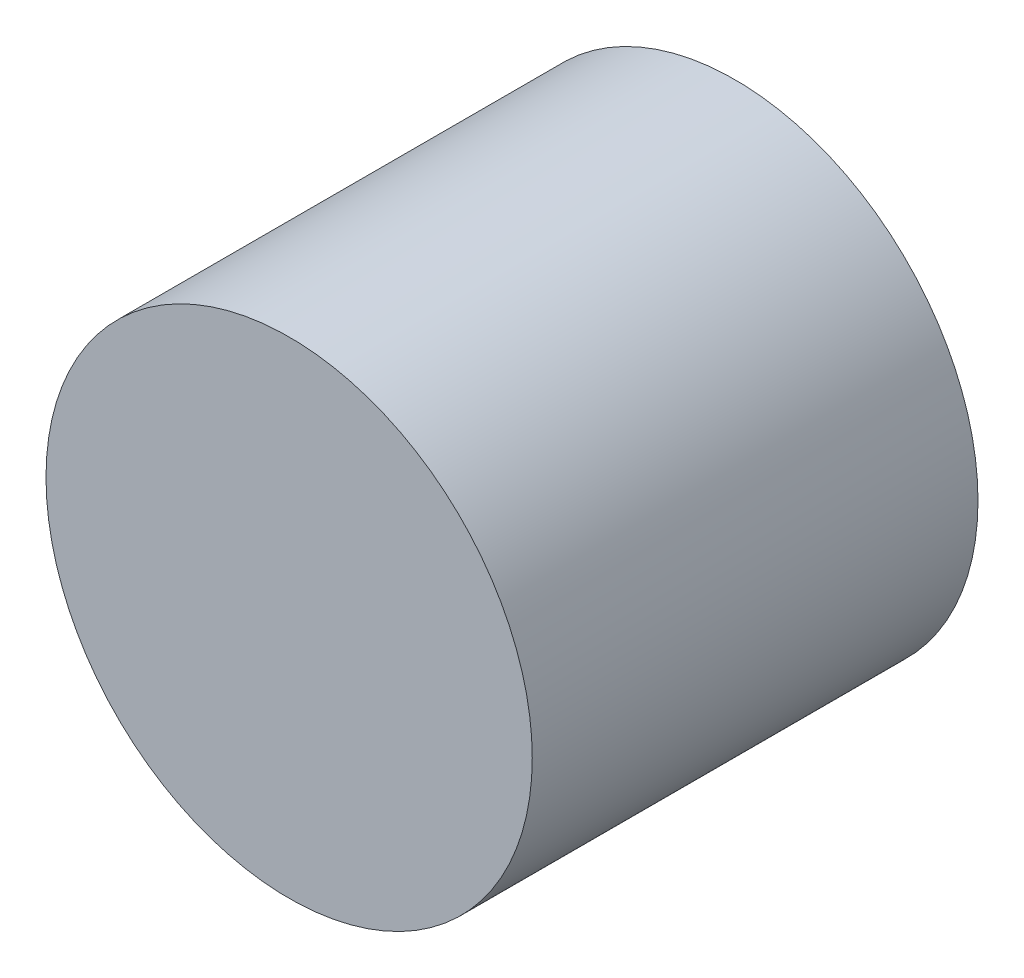
ISO-10303-21;
HEADER;
FILE_DESCRIPTION(('STEP AP214'),'2;1');
FILE_NAME('part.step','',(''),(''),'','','');
FILE_SCHEMA(('AUTOMOTIVE_DESIGN { 1 0 10303 214 1 1 1 1 }'));
ENDSEC;
DATA;
#1=APPLICATION_CONTEXT('core data for automotive mechanical design processes');
#2=APPLICATION_PROTOCOL_DEFINITION('international standard','automotive_design',2000,#1);
#3=PRODUCT_CONTEXT('',#1,'mechanical');
#4=PRODUCT('Part','Part','',(#3));
#5=PRODUCT_RELATED_PRODUCT_CATEGORY('part','',(#4));
#6=PRODUCT_DEFINITION_FORMATION('','',#4);
#7=PRODUCT_DEFINITION_CONTEXT('part definition',#1,'design');
#8=PRODUCT_DEFINITION('design','',#6,#7);
#9=PRODUCT_DEFINITION_SHAPE('','',#8);
#10=(LENGTH_UNIT() NAMED_UNIT(*) SI_UNIT(.MILLI.,.METRE.));
#11=(NAMED_UNIT(*) PLANE_ANGLE_UNIT() SI_UNIT($,.RADIAN.));
#12=(NAMED_UNIT(*) SI_UNIT($,.STERADIAN.) SOLID_ANGLE_UNIT());
#13=UNCERTAINTY_MEASURE_WITH_UNIT(LENGTH_MEASURE(1.E-05),#10,'distance_accuracy_value','');
#14=(GEOMETRIC_REPRESENTATION_CONTEXT(3) GLOBAL_UNCERTAINTY_ASSIGNED_CONTEXT((#13)) GLOBAL_UNIT_ASSIGNED_CONTEXT((#10,
#11,#12)) REPRESENTATION_CONTEXT('',''));
#15=CARTESIAN_POINT('',(0.,0.,0.));
#16=DIRECTION('',(0.,0.,1.));
#17=DIRECTION('',(1.,0.,0.));
#18=AXIS2_PLACEMENT_3D('',#15,#16,#17);
#19=CARTESIAN_POINT('',(0.,0.,11.));
#20=DIRECTION('',(0.,0.,-1.));
#21=DIRECTION('',(-1.,0.,0.));
#22=AXIS2_PLACEMENT_3D('',#19,#20,#21);
#23=CYLINDRICAL_SURFACE('',#22,6.);
#24=CARTESIAN_POINT('',(0.,0.,11.));
#25=DIRECTION('',(0.,0.,1.));
#26=DIRECTION('',(1.,0.,0.));
#27=AXIS2_PLACEMENT_3D('',#24,#25,#26);
#28=CIRCLE('',#27,6.);
#29=CARTESIAN_POINT('',(6.,0.,11.));
#30=VERTEX_POINT('',#29);
#31=EDGE_CURVE('E10',#30,#30,#28,.T.);
#32=ORIENTED_EDGE('',*,*,#31,.F.);
#33=EDGE_LOOP('',(#32));
#34=FACE_BOUND('',#33,.T.);
#35=CARTESIAN_POINT('',(0.,0.,0.));
#36=DIRECTION('',(0.,0.,1.));
#37=DIRECTION('',(1.,0.,0.));
#38=AXIS2_PLACEMENT_3D('',#35,#36,#37);
#39=CIRCLE('',#38,6.);
#40=CARTESIAN_POINT('',(6.,0.,0.));
#41=VERTEX_POINT('',#40);
#42=EDGE_CURVE('E42',#41,#41,#39,.T.);
#43=ORIENTED_EDGE('',*,*,#42,.T.);
#44=EDGE_LOOP('',(#43));
#45=FACE_BOUND('',#44,.T.);
#46=ADVANCED_FACE('F39',(#34,#45),#23,.T.);
#47=CARTESIAN_POINT('',(0.,0.,11.));
#48=DIRECTION('',(0.,0.,1.));
#49=DIRECTION('',(1.,0.,0.));
#50=AXIS2_PLACEMENT_3D('',#47,#48,#49);
#51=PLANE('',#50);
#52=ORIENTED_EDGE('',*,*,#31,.T.);
#53=EDGE_LOOP('',(#52));
#54=FACE_BOUND('',#53,.T.);
#55=ADVANCED_FACE('F54',(#54),#51,.T.);
#56=CARTESIAN_POINT('',(0.,0.,0.));
#57=DIRECTION('',(0.,0.,1.));
#58=DIRECTION('',(1.,0.,0.));
#59=AXIS2_PLACEMENT_3D('',#56,#57,#58);
#60=PLANE('',#59);
#61=ORIENTED_EDGE('',*,*,#42,.F.);
#62=EDGE_LOOP('',(#61));
#63=FACE_BOUND('',#62,.T.);
#64=ADVANCED_FACE('F52',(#63),#60,.F.);
#65=CLOSED_SHELL('',(#46,#55,#64));
#66=MANIFOLD_SOLID_BREP('B2',#65);
#67=ADVANCED_BREP_SHAPE_REPRESENTATION('',(#18,#66),#14);
#68=SHAPE_DEFINITION_REPRESENTATION(#9,#67);
ENDSEC;
END-ISO-10303-21;
